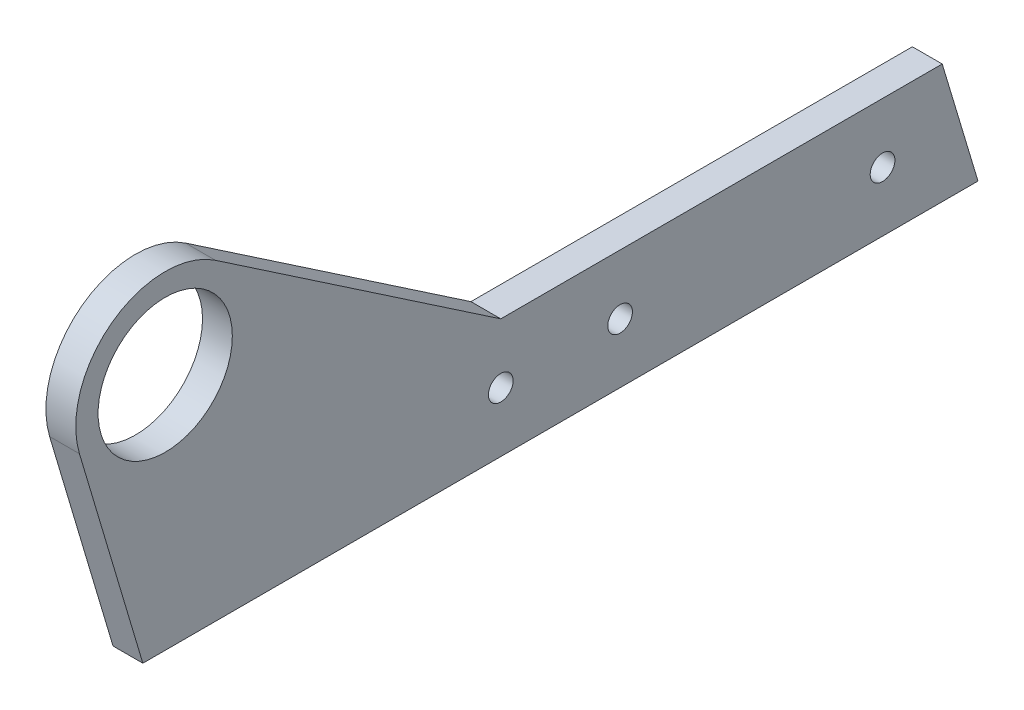
ISO-10303-21;
HEADER;
FILE_DESCRIPTION(('STEP AP214'),'2;1');
FILE_NAME('part.step','',(''),(''),'','','');
FILE_SCHEMA(('AUTOMOTIVE_DESIGN { 1 0 10303 214 1 1 1 1 }'));
ENDSEC;
DATA;
#1=APPLICATION_CONTEXT('core data for automotive mechanical design processes');
#2=APPLICATION_PROTOCOL_DEFINITION('international standard','automotive_design',2000,#1);
#3=PRODUCT_CONTEXT('',#1,'mechanical');
#4=PRODUCT('Part','Part','',(#3));
#5=PRODUCT_RELATED_PRODUCT_CATEGORY('part','',(#4));
#6=PRODUCT_DEFINITION_FORMATION('','',#4);
#7=PRODUCT_DEFINITION_CONTEXT('part definition',#1,'design');
#8=PRODUCT_DEFINITION('design','',#6,#7);
#9=PRODUCT_DEFINITION_SHAPE('','',#8);
#10=(LENGTH_UNIT() NAMED_UNIT(*) SI_UNIT(.MILLI.,.METRE.));
#11=(NAMED_UNIT(*) PLANE_ANGLE_UNIT() SI_UNIT($,.RADIAN.));
#12=(NAMED_UNIT(*) SI_UNIT($,.STERADIAN.) SOLID_ANGLE_UNIT());
#13=UNCERTAINTY_MEASURE_WITH_UNIT(LENGTH_MEASURE(1.E-05),#10,'distance_accuracy_value','');
#14=(GEOMETRIC_REPRESENTATION_CONTEXT(3) GLOBAL_UNCERTAINTY_ASSIGNED_CONTEXT((#13)) GLOBAL_UNIT_ASSIGNED_CONTEXT((#10,
#11,#12)) REPRESENTATION_CONTEXT('',''));
#15=CARTESIAN_POINT('',(0.,0.,0.));
#16=DIRECTION('',(0.,0.,1.));
#17=DIRECTION('',(1.,0.,0.));
#18=AXIS2_PLACEMENT_3D('',#15,#16,#17);
#19=CARTESIAN_POINT('',(6.35,38.1,84.1375));
#20=DIRECTION('',(1.,0.,0.));
#21=DIRECTION('',(0.,0.,-1.));
#22=AXIS2_PLACEMENT_3D('',#19,#20,#21);
#23=PLANE('',#22);
#24=CARTESIAN_POINT('',(6.35,0.,-12.7));
#25=DIRECTION('',(1.,0.,0.));
#26=DIRECTION('',(0.,0.,-1.));
#27=AXIS2_PLACEMENT_3D('',#24,#25,#26);
#28=CIRCLE('',#27,2.6289);
#29=CARTESIAN_POINT('',(6.35,0.,-15.3289));
#30=VERTEX_POINT('',#29);
#31=EDGE_CURVE('E192',#30,#30,#28,.T.);
#32=ORIENTED_EDGE('',*,*,#31,.F.);
#33=EDGE_LOOP('',(#32));
#34=FACE_BOUND('',#33,.T.);
#35=CARTESIAN_POINT('',(6.35,38.1,84.1375));
#36=DIRECTION('',(1.,0.,0.));
#37=DIRECTION('',(0.,0.,-1.));
#38=AXIS2_PLACEMENT_3D('',#35,#36,#37);
#39=CIRCLE('',#38,14.2875);
#40=CARTESIAN_POINT('',(6.35,38.1,69.85));
#41=VERTEX_POINT('',#40);
#42=EDGE_CURVE('E122',#41,#41,#39,.T.);
#43=ORIENTED_EDGE('',*,*,#42,.F.);
#44=EDGE_LOOP('',(#43));
#45=FACE_BOUND('',#44,.T.);
#46=DIRECTION('',(0.,0.,-1.));
#47=VECTOR('',#46,1.);
#48=CARTESIAN_POINT('',(6.35,-12.7,12.7));
#49=LINE('',#48,#47);
#50=CARTESIAN_POINT('',(6.35,-12.7,88.9));
#51=VERTEX_POINT('',#50);
#52=CARTESIAN_POINT('',(6.35,-12.7,-88.9));
#53=VERTEX_POINT('',#52);
#54=EDGE_CURVE('E50',#51,#53,#49,.T.);
#55=ORIENTED_EDGE('',*,*,#54,.T.);
#56=DIRECTION('',(0.,0.957826285221151,0.287347885566345));
#57=VECTOR('',#56,1.);
#58=CARTESIAN_POINT('',(6.35,-12.7,-88.9));
#59=LINE('',#58,#57);
#60=CARTESIAN_POINT('',(6.35,12.7,-81.28));
#61=VERTEX_POINT('',#60);
#62=EDGE_CURVE('E137',#53,#61,#59,.T.);
#63=ORIENTED_EDGE('',*,*,#62,.T.);
#64=DIRECTION('',(0.,0.,1.));
#65=VECTOR('',#64,1.);
#66=CARTESIAN_POINT('',(6.35,12.7,-25.4));
#67=LINE('',#66,#65);
#68=CARTESIAN_POINT('',(6.35,12.7,12.7));
#69=VERTEX_POINT('',#68);
#70=EDGE_CURVE('E98',#61,#69,#67,.T.);
#71=ORIENTED_EDGE('',*,*,#70,.T.);
#72=DIRECTION('',(0.,0.561000945727697,0.827815159859149));
#73=VECTOR('',#72,1.);
#74=CARTESIAN_POINT('',(6.35,12.7,12.7));
#75=LINE('',#74,#73);
#76=CARTESIAN_POINT('',(6.35,53.8698787953168,73.4504319838874));
#77=VERTEX_POINT('',#76);
#78=EDGE_CURVE('E92',#69,#77,#75,.T.);
#79=ORIENTED_EDGE('',*,*,#78,.T.);
#80=CARTESIAN_POINT('',(6.35,38.1,84.1375));
#81=DIRECTION('',(1.,0.,0.));
#82=DIRECTION('',(0.,0.,-1.));
#83=AXIS2_PLACEMENT_3D('',#80,#81,#82);
#84=CIRCLE('',#83,19.05);
#85=CARTESIAN_POINT('',(6.35,32.6680448095494,102.396644635194));
#86=VERTEX_POINT('',#85);
#87=EDGE_CURVE('E96',#77,#86,#84,.T.);
#88=ORIENTED_EDGE('',*,*,#87,.T.);
#89=DIRECTION('',(0.,-0.958485282687354,-0.28514200474806));
#90=VECTOR('',#89,1.);
#91=CARTESIAN_POINT('',(6.35,-12.7,88.9));
#92=LINE('',#91,#90);
#93=EDGE_CURVE('E112',#86,#51,#92,.T.);
#94=ORIENTED_EDGE('',*,*,#93,.T.);
#95=EDGE_LOOP('',(#55,#63,#71,#79,#88,#94));
#96=FACE_BOUND('',#95,.T.);
#97=CARTESIAN_POINT('',(6.35,0.,12.7));
#98=DIRECTION('',(1.,0.,0.));
#99=DIRECTION('',(0.,0.,-1.));
#100=AXIS2_PLACEMENT_3D('',#97,#98,#99);
#101=CIRCLE('',#100,2.6289);
#102=CARTESIAN_POINT('',(6.35,0.,10.0711));
#103=VERTEX_POINT('',#102);
#104=EDGE_CURVE('E198',#103,#103,#101,.T.);
#105=ORIENTED_EDGE('',*,*,#104,.F.);
#106=EDGE_LOOP('',(#105));
#107=FACE_BOUND('',#106,.T.);
#108=CARTESIAN_POINT('',(6.35,0.,-68.58));
#109=DIRECTION('',(1.,0.,0.));
#110=DIRECTION('',(0.,0.,-1.));
#111=AXIS2_PLACEMENT_3D('',#108,#109,#110);
#112=CIRCLE('',#111,2.62890000000001);
#113=CARTESIAN_POINT('',(6.35,0.,-71.2089));
#114=VERTEX_POINT('',#113);
#115=EDGE_CURVE('E183',#114,#114,#112,.T.);
#116=ORIENTED_EDGE('',*,*,#115,.F.);
#117=EDGE_LOOP('',(#116));
#118=FACE_BOUND('',#117,.T.);
#119=ADVANCED_FACE('F33',(#34,#45,#96,#107,#118),#23,.T.);
#120=CARTESIAN_POINT('',(0.,38.1,84.1375));
#121=DIRECTION('',(1.,0.,0.));
#122=DIRECTION('',(0.,0.,-1.));
#123=AXIS2_PLACEMENT_3D('',#120,#121,#122);
#124=PLANE('',#123);
#125=DIRECTION('',(0.,0.957826285221151,0.287347885566345));
#126=VECTOR('',#125,1.);
#127=CARTESIAN_POINT('',(0.,-12.7,-88.9));
#128=LINE('',#127,#126);
#129=CARTESIAN_POINT('',(0.,-12.7,-88.9));
#130=VERTEX_POINT('',#129);
#131=CARTESIAN_POINT('',(0.,12.7,-81.28));
#132=VERTEX_POINT('',#131);
#133=EDGE_CURVE('E118',#130,#132,#128,.T.);
#134=ORIENTED_EDGE('',*,*,#133,.F.);
#135=DIRECTION('',(0.,0.,-1.));
#136=VECTOR('',#135,1.);
#137=CARTESIAN_POINT('',(0.,-12.7,12.7));
#138=LINE('',#137,#136);
#139=CARTESIAN_POINT('',(0.,-12.7,88.9));
#140=VERTEX_POINT('',#139);
#141=EDGE_CURVE('E127',#140,#130,#138,.T.);
#142=ORIENTED_EDGE('',*,*,#141,.F.);
#143=DIRECTION('',(0.,-0.958485282687354,-0.28514200474806));
#144=VECTOR('',#143,1.);
#145=CARTESIAN_POINT('',(0.,-12.7,88.9));
#146=LINE('',#145,#144);
#147=CARTESIAN_POINT('',(0.,32.6680448095494,102.396644635194));
#148=VERTEX_POINT('',#147);
#149=EDGE_CURVE('E81',#148,#140,#146,.T.);
#150=ORIENTED_EDGE('',*,*,#149,.F.);
#151=CARTESIAN_POINT('',(0.,38.1,84.1375));
#152=DIRECTION('',(1.,0.,0.));
#153=DIRECTION('',(0.,0.,-1.));
#154=AXIS2_PLACEMENT_3D('',#151,#152,#153);
#155=CIRCLE('',#154,19.05);
#156=CARTESIAN_POINT('',(0.,53.8698787953168,73.4504319838874));
#157=VERTEX_POINT('',#156);
#158=EDGE_CURVE('E74',#157,#148,#155,.T.);
#159=ORIENTED_EDGE('',*,*,#158,.F.);
#160=DIRECTION('',(0.,0.561000945727697,0.827815159859149));
#161=VECTOR('',#160,1.);
#162=CARTESIAN_POINT('',(0.,12.7,12.7));
#163=LINE('',#162,#161);
#164=CARTESIAN_POINT('',(0.,12.7,12.7));
#165=VERTEX_POINT('',#164);
#166=EDGE_CURVE('E106',#165,#157,#163,.T.);
#167=ORIENTED_EDGE('',*,*,#166,.F.);
#168=DIRECTION('',(0.,0.,1.));
#169=VECTOR('',#168,1.);
#170=CARTESIAN_POINT('',(0.,12.7,12.7));
#171=LINE('',#170,#169);
#172=EDGE_CURVE('E121',#132,#165,#171,.T.);
#173=ORIENTED_EDGE('',*,*,#172,.F.);
#174=EDGE_LOOP('',(#134,#142,#150,#159,#167,#173));
#175=FACE_BOUND('',#174,.T.);
#176=CARTESIAN_POINT('',(0.,38.1,84.1375));
#177=DIRECTION('',(1.,0.,0.));
#178=DIRECTION('',(0.,0.,-1.));
#179=AXIS2_PLACEMENT_3D('',#176,#177,#178);
#180=CIRCLE('',#179,14.2875);
#181=CARTESIAN_POINT('',(0.,38.1,69.85));
#182=VERTEX_POINT('',#181);
#183=EDGE_CURVE('E201',#182,#182,#180,.T.);
#184=ORIENTED_EDGE('',*,*,#183,.T.);
#185=EDGE_LOOP('',(#184));
#186=FACE_BOUND('',#185,.T.);
#187=CARTESIAN_POINT('',(0.,0.,12.7));
#188=DIRECTION('',(1.,0.,0.));
#189=DIRECTION('',(0.,0.,-1.));
#190=AXIS2_PLACEMENT_3D('',#187,#188,#189);
#191=CIRCLE('',#190,2.6289);
#192=CARTESIAN_POINT('',(0.,0.,10.0711));
#193=VERTEX_POINT('',#192);
#194=EDGE_CURVE('E195',#193,#193,#191,.T.);
#195=ORIENTED_EDGE('',*,*,#194,.T.);
#196=EDGE_LOOP('',(#195));
#197=FACE_BOUND('',#196,.T.);
#198=CARTESIAN_POINT('',(0.,0.,-12.7));
#199=DIRECTION('',(1.,0.,0.));
#200=DIRECTION('',(0.,0.,-1.));
#201=AXIS2_PLACEMENT_3D('',#198,#199,#200);
#202=CIRCLE('',#201,2.6289);
#203=CARTESIAN_POINT('',(0.,0.,-15.3289));
#204=VERTEX_POINT('',#203);
#205=EDGE_CURVE('E189',#204,#204,#202,.T.);
#206=ORIENTED_EDGE('',*,*,#205,.T.);
#207=EDGE_LOOP('',(#206));
#208=FACE_BOUND('',#207,.T.);
#209=CARTESIAN_POINT('',(0.,0.,-68.58));
#210=DIRECTION('',(1.,0.,0.));
#211=DIRECTION('',(0.,0.,-1.));
#212=AXIS2_PLACEMENT_3D('',#209,#210,#211);
#213=CIRCLE('',#212,2.62890000000001);
#214=CARTESIAN_POINT('',(0.,0.,-71.2089));
#215=VERTEX_POINT('',#214);
#216=EDGE_CURVE('E186',#215,#215,#213,.T.);
#217=ORIENTED_EDGE('',*,*,#216,.T.);
#218=EDGE_LOOP('',(#217));
#219=FACE_BOUND('',#218,.T.);
#220=ADVANCED_FACE('F141',(#175,#186,#197,#208,#219),#124,.F.);
#221=CARTESIAN_POINT('',(6.35,-12.7,-88.9));
#222=DIRECTION('',(0.,-0.287347885566345,0.957826285221151));
#223=DIRECTION('',(0.,-0.957826285221152,-0.287347885566346));
#224=AXIS2_PLACEMENT_3D('',#221,#222,#223);
#225=PLANE('',#224);
#226=ORIENTED_EDGE('',*,*,#133,.T.);
#227=DIRECTION('',(-1.,0.,0.));
#228=VECTOR('',#227,1.);
#229=CARTESIAN_POINT('',(6.35,12.7,-81.28));
#230=LINE('',#229,#228);
#231=EDGE_CURVE('E42',#61,#132,#230,.T.);
#232=ORIENTED_EDGE('',*,*,#231,.F.);
#233=ORIENTED_EDGE('',*,*,#62,.F.);
#234=DIRECTION('',(-1.,0.,0.));
#235=VECTOR('',#234,1.);
#236=CARTESIAN_POINT('',(6.35,-12.7,-88.9));
#237=LINE('',#236,#235);
#238=EDGE_CURVE('E11',#53,#130,#237,.T.);
#239=ORIENTED_EDGE('',*,*,#238,.T.);
#240=EDGE_LOOP('',(#226,#232,#233,#239));
#241=FACE_BOUND('',#240,.T.);
#242=ADVANCED_FACE('F35',(#241),#225,.F.);
#243=CARTESIAN_POINT('',(6.35,12.7,12.7));
#244=DIRECTION('',(0.,-1.,0.));
#245=DIRECTION('',(0.,0.,-1.));
#246=AXIS2_PLACEMENT_3D('',#243,#244,#245);
#247=PLANE('',#246);
#248=ORIENTED_EDGE('',*,*,#172,.T.);
#249=DIRECTION('',(-1.,0.,0.));
#250=VECTOR('',#249,1.);
#251=CARTESIAN_POINT('',(6.35,12.7,12.7));
#252=LINE('',#251,#250);
#253=EDGE_CURVE('E107',#69,#165,#252,.T.);
#254=ORIENTED_EDGE('',*,*,#253,.F.);
#255=ORIENTED_EDGE('',*,*,#70,.F.);
#256=ORIENTED_EDGE('',*,*,#231,.T.);
#257=EDGE_LOOP('',(#248,#254,#255,#256));
#258=FACE_BOUND('',#257,.T.);
#259=ADVANCED_FACE('F134',(#258),#247,.F.);
#260=CARTESIAN_POINT('',(6.35,12.7,12.7));
#261=DIRECTION('',(0.,-0.827815159859149,0.561000945727697));
#262=DIRECTION('',(0.,-0.561000945727697,-0.827815159859149));
#263=AXIS2_PLACEMENT_3D('',#260,#261,#262);
#264=PLANE('',#263);
#265=ORIENTED_EDGE('',*,*,#166,.T.);
#266=DIRECTION('',(-1.,0.,0.));
#267=VECTOR('',#266,1.);
#268=CARTESIAN_POINT('',(6.35,53.8698787953168,73.4504319838874));
#269=LINE('',#268,#267);
#270=EDGE_CURVE('E103',#77,#157,#269,.T.);
#271=ORIENTED_EDGE('',*,*,#270,.F.);
#272=ORIENTED_EDGE('',*,*,#78,.F.);
#273=ORIENTED_EDGE('',*,*,#253,.T.);
#274=EDGE_LOOP('',(#265,#271,#272,#273));
#275=FACE_BOUND('',#274,.T.);
#276=ADVANCED_FACE('F104',(#275),#264,.F.);
#277=CARTESIAN_POINT('',(6.35,38.1,84.1375));
#278=DIRECTION('',(-1.,0.,0.));
#279=DIRECTION('',(0.,0.,1.));
#280=AXIS2_PLACEMENT_3D('',#277,#278,#279);
#281=CYLINDRICAL_SURFACE('',#280,19.05);
#282=ORIENTED_EDGE('',*,*,#158,.T.);
#283=DIRECTION('',(-1.,0.,0.));
#284=VECTOR('',#283,1.);
#285=CARTESIAN_POINT('',(6.35,32.6680448095494,102.396644635194));
#286=LINE('',#285,#284);
#287=EDGE_CURVE('E108',#86,#148,#286,.T.);
#288=ORIENTED_EDGE('',*,*,#287,.F.);
#289=ORIENTED_EDGE('',*,*,#87,.F.);
#290=ORIENTED_EDGE('',*,*,#270,.T.);
#291=EDGE_LOOP('',(#282,#288,#289,#290));
#292=FACE_BOUND('',#291,.T.);
#293=ADVANCED_FACE('F110',(#292),#281,.T.);
#294=CARTESIAN_POINT('',(6.35,-12.7,88.9));
#295=DIRECTION('',(0.,0.28514200474806,-0.958485282687354));
#296=DIRECTION('',(0.,0.958485282687354,0.28514200474806));
#297=AXIS2_PLACEMENT_3D('',#294,#295,#296);
#298=PLANE('',#297);
#299=ORIENTED_EDGE('',*,*,#149,.T.);
#300=DIRECTION('',(-1.,0.,0.));
#301=VECTOR('',#300,1.);
#302=CARTESIAN_POINT('',(6.35,-12.7,88.9));
#303=LINE('',#302,#301);
#304=EDGE_CURVE('E114',#51,#140,#303,.T.);
#305=ORIENTED_EDGE('',*,*,#304,.F.);
#306=ORIENTED_EDGE('',*,*,#93,.F.);
#307=ORIENTED_EDGE('',*,*,#287,.T.);
#308=EDGE_LOOP('',(#299,#305,#306,#307));
#309=FACE_BOUND('',#308,.T.);
#310=ADVANCED_FACE('F144',(#309),#298,.F.);
#311=CARTESIAN_POINT('',(6.35,-12.7,12.7));
#312=DIRECTION('',(0.,1.,0.));
#313=DIRECTION('',(0.,0.,1.));
#314=AXIS2_PLACEMENT_3D('',#311,#312,#313);
#315=PLANE('',#314);
#316=ORIENTED_EDGE('',*,*,#141,.T.);
#317=ORIENTED_EDGE('',*,*,#238,.F.);
#318=ORIENTED_EDGE('',*,*,#54,.F.);
#319=ORIENTED_EDGE('',*,*,#304,.T.);
#320=EDGE_LOOP('',(#316,#317,#318,#319));
#321=FACE_BOUND('',#320,.T.);
#322=ADVANCED_FACE('F143',(#321),#315,.F.);
#323=CARTESIAN_POINT('',(6.35,38.1,84.1375));
#324=DIRECTION('',(-1.,0.,0.));
#325=DIRECTION('',(0.,0.,1.));
#326=AXIS2_PLACEMENT_3D('',#323,#324,#325);
#327=CYLINDRICAL_SURFACE('',#326,14.2875);
#328=ORIENTED_EDGE('',*,*,#42,.T.);
#329=EDGE_LOOP('',(#328));
#330=FACE_BOUND('',#329,.T.);
#331=ORIENTED_EDGE('',*,*,#183,.F.);
#332=EDGE_LOOP('',(#331));
#333=FACE_BOUND('',#332,.T.);
#334=ADVANCED_FACE('F151',(#330,#333),#327,.F.);
#335=CARTESIAN_POINT('',(6.35,0.,12.7));
#336=DIRECTION('',(-1.,0.,0.));
#337=DIRECTION('',(0.,0.,1.));
#338=AXIS2_PLACEMENT_3D('',#335,#336,#337);
#339=CYLINDRICAL_SURFACE('',#338,2.6289);
#340=ORIENTED_EDGE('',*,*,#104,.T.);
#341=EDGE_LOOP('',(#340));
#342=FACE_BOUND('',#341,.T.);
#343=ORIENTED_EDGE('',*,*,#194,.F.);
#344=EDGE_LOOP('',(#343));
#345=FACE_BOUND('',#344,.T.);
#346=ADVANCED_FACE('F166',(#342,#345),#339,.F.);
#347=CARTESIAN_POINT('',(6.35,0.,-12.7));
#348=DIRECTION('',(-1.,0.,0.));
#349=DIRECTION('',(0.,0.,1.));
#350=AXIS2_PLACEMENT_3D('',#347,#348,#349);
#351=CYLINDRICAL_SURFACE('',#350,2.6289);
#352=ORIENTED_EDGE('',*,*,#31,.T.);
#353=EDGE_LOOP('',(#352));
#354=FACE_BOUND('',#353,.T.);
#355=ORIENTED_EDGE('',*,*,#205,.F.);
#356=EDGE_LOOP('',(#355));
#357=FACE_BOUND('',#356,.T.);
#358=ADVANCED_FACE('F170',(#354,#357),#351,.F.);
#359=CARTESIAN_POINT('',(6.35,0.,-68.58));
#360=DIRECTION('',(-1.,0.,0.));
#361=DIRECTION('',(0.,0.,1.));
#362=AXIS2_PLACEMENT_3D('',#359,#360,#361);
#363=CYLINDRICAL_SURFACE('',#362,2.62890000000001);
#364=ORIENTED_EDGE('',*,*,#115,.T.);
#365=EDGE_LOOP('',(#364));
#366=FACE_BOUND('',#365,.T.);
#367=ORIENTED_EDGE('',*,*,#216,.F.);
#368=EDGE_LOOP('',(#367));
#369=FACE_BOUND('',#368,.T.);
#370=ADVANCED_FACE('F174',(#366,#369),#363,.F.);
#371=CLOSED_SHELL('',(#119,#220,#242,#259,#276,#293,#310,#322,#334,#346,#358,#370));
#372=MANIFOLD_SOLID_BREP('B2',#371);
#373=ADVANCED_BREP_SHAPE_REPRESENTATION('',(#18,#372),#14);
#374=SHAPE_DEFINITION_REPRESENTATION(#9,#373);
ENDSEC;
END-ISO-10303-21;
